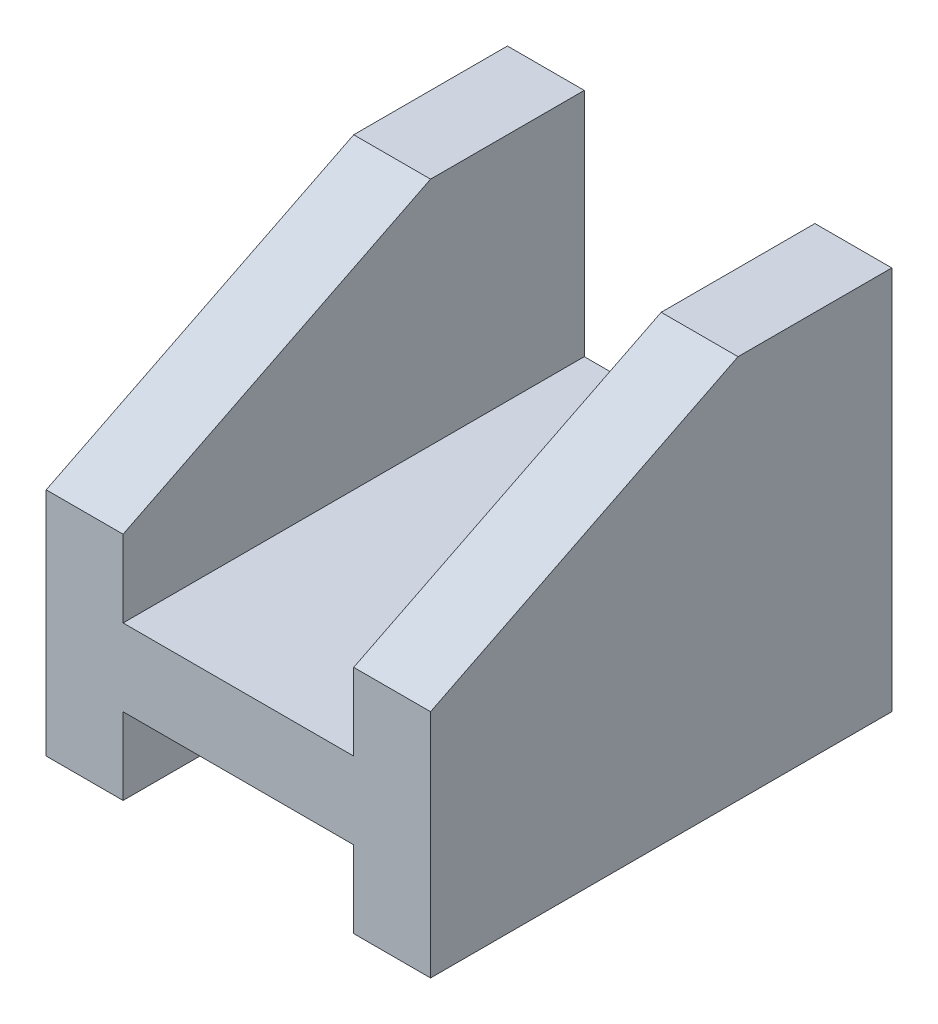
ISO-10303-21;
HEADER;
FILE_DESCRIPTION(('STEP AP214'),'2;1');
FILE_NAME('part.step','',(''),(''),'','','');
FILE_SCHEMA(('AUTOMOTIVE_DESIGN { 1 0 10303 214 1 1 1 1 }'));
ENDSEC;
DATA;
#1=APPLICATION_CONTEXT('core data for automotive mechanical design processes');
#2=APPLICATION_PROTOCOL_DEFINITION('international standard','automotive_design',2000,#1);
#3=PRODUCT_CONTEXT('',#1,'mechanical');
#4=PRODUCT('Part','Part','',(#3));
#5=PRODUCT_RELATED_PRODUCT_CATEGORY('part','',(#4));
#6=PRODUCT_DEFINITION_FORMATION('','',#4);
#7=PRODUCT_DEFINITION_CONTEXT('part definition',#1,'design');
#8=PRODUCT_DEFINITION('design','',#6,#7);
#9=PRODUCT_DEFINITION_SHAPE('','',#8);
#10=(LENGTH_UNIT() NAMED_UNIT(*) SI_UNIT(.MILLI.,.METRE.));
#11=(NAMED_UNIT(*) PLANE_ANGLE_UNIT() SI_UNIT($,.RADIAN.));
#12=(NAMED_UNIT(*) SI_UNIT($,.STERADIAN.) SOLID_ANGLE_UNIT());
#13=UNCERTAINTY_MEASURE_WITH_UNIT(LENGTH_MEASURE(1.E-05),#10,'distance_accuracy_value','');
#14=(GEOMETRIC_REPRESENTATION_CONTEXT(3) GLOBAL_UNCERTAINTY_ASSIGNED_CONTEXT((#13)) GLOBAL_UNIT_ASSIGNED_CONTEXT((#10,
#11,#12)) REPRESENTATION_CONTEXT('',''));
#15=CARTESIAN_POINT('',(0.,0.,0.));
#16=DIRECTION('',(0.,0.,1.));
#17=DIRECTION('',(1.,0.,0.));
#18=AXIS2_PLACEMENT_3D('',#15,#16,#17);
#19=CARTESIAN_POINT('',(9.525,-3.55,38.1));
#20=DIRECTION('',(1.,0.,0.));
#21=DIRECTION('',(0.,1.,0.));
#22=AXIS2_PLACEMENT_3D('',#19,#20,#21);
#23=PLANE('',#22);
#24=DIRECTION('',(0.,-1.,0.));
#25=VECTOR('',#24,1.);
#26=CARTESIAN_POINT('',(9.525,-3.55,0.));
#27=LINE('',#26,#25);
#28=CARTESIAN_POINT('',(9.525,-3.55,0.));
#29=VERTEX_POINT('',#28);
#30=CARTESIAN_POINT('',(9.525,-9.9,0.));
#31=VERTEX_POINT('',#30);
#32=EDGE_CURVE('E187',#29,#31,#27,.T.);
#33=ORIENTED_EDGE('',*,*,#32,.T.);
#34=DIRECTION('',(0.,0.,-1.));
#35=VECTOR('',#34,1.);
#36=CARTESIAN_POINT('',(9.525,-9.9,38.1));
#37=LINE('',#36,#35);
#38=CARTESIAN_POINT('',(9.525,-9.9,38.1));
#39=VERTEX_POINT('',#38);
#40=EDGE_CURVE('E40',#39,#31,#37,.T.);
#41=ORIENTED_EDGE('',*,*,#40,.F.);
#42=DIRECTION('',(0.,-1.,0.));
#43=VECTOR('',#42,1.);
#44=CARTESIAN_POINT('',(9.525,-3.55,38.1));
#45=LINE('',#44,#43);
#46=CARTESIAN_POINT('',(9.525,-3.55,38.1));
#47=VERTEX_POINT('',#46);
#48=EDGE_CURVE('E221',#47,#39,#45,.T.);
#49=ORIENTED_EDGE('',*,*,#48,.F.);
#50=DIRECTION('',(0.,0.,-1.));
#51=VECTOR('',#50,1.);
#52=CARTESIAN_POINT('',(9.525,-3.55,38.1));
#53=LINE('',#52,#51);
#54=EDGE_CURVE('E189',#47,#29,#53,.T.);
#55=ORIENTED_EDGE('',*,*,#54,.T.);
#56=EDGE_LOOP('',(#33,#41,#49,#55));
#57=FACE_BOUND('',#56,.T.);
#58=ADVANCED_FACE('F33',(#57),#23,.F.);
#59=CARTESIAN_POINT('',(15.875,-9.9,38.1));
#60=DIRECTION('',(0.,1.,0.));
#61=DIRECTION('',(0.,0.,1.));
#62=AXIS2_PLACEMENT_3D('',#59,#60,#61);
#63=PLANE('',#62);
#64=DIRECTION('',(1.,0.,0.));
#65=VECTOR('',#64,1.);
#66=CARTESIAN_POINT('',(15.875,-9.9,0.));
#67=LINE('',#66,#65);
#68=CARTESIAN_POINT('',(15.875,-9.9,0.));
#69=VERTEX_POINT('',#68);
#70=EDGE_CURVE('E180',#31,#69,#67,.T.);
#71=ORIENTED_EDGE('',*,*,#70,.T.);
#72=DIRECTION('',(0.,0.,-1.));
#73=VECTOR('',#72,1.);
#74=CARTESIAN_POINT('',(15.875,-9.9,38.1));
#75=LINE('',#74,#73);
#76=CARTESIAN_POINT('',(15.875,-9.9,38.1));
#77=VERTEX_POINT('',#76);
#78=EDGE_CURVE('E172',#77,#69,#75,.T.);
#79=ORIENTED_EDGE('',*,*,#78,.F.);
#80=DIRECTION('',(1.,0.,0.));
#81=VECTOR('',#80,1.);
#82=CARTESIAN_POINT('',(15.875,-9.9,38.1));
#83=LINE('',#82,#81);
#84=EDGE_CURVE('E181',#39,#77,#83,.T.);
#85=ORIENTED_EDGE('',*,*,#84,.F.);
#86=ORIENTED_EDGE('',*,*,#40,.T.);
#87=EDGE_LOOP('',(#71,#79,#85,#86));
#88=FACE_BOUND('',#87,.T.);
#89=ADVANCED_FACE('F178',(#88),#63,.F.);
#90=CARTESIAN_POINT('',(15.875,21.85,38.1));
#91=DIRECTION('',(-1.,0.,0.));
#92=DIRECTION('',(0.,-1.,0.));
#93=AXIS2_PLACEMENT_3D('',#90,#91,#92);
#94=PLANE('',#93);
#95=DIRECTION('',(0.,0.,-1.));
#96=VECTOR('',#95,1.);
#97=CARTESIAN_POINT('',(15.875,21.85,38.1));
#98=LINE('',#97,#96);
#99=CARTESIAN_POINT('',(15.875,21.85,12.7));
#100=VERTEX_POINT('',#99);
#101=CARTESIAN_POINT('',(15.875,21.85,0.));
#102=VERTEX_POINT('',#101);
#103=EDGE_CURVE('E170',#100,#102,#98,.T.);
#104=ORIENTED_EDGE('',*,*,#103,.F.);
#105=DIRECTION('',(0.,0.447213595499958,-0.894427190999916));
#106=VECTOR('',#105,1.);
#107=CARTESIAN_POINT('',(15.875,9.15,38.1));
#108=LINE('',#107,#106);
#109=CARTESIAN_POINT('',(15.875,9.15,38.1));
#110=VERTEX_POINT('',#109);
#111=EDGE_CURVE('E147',#110,#100,#108,.T.);
#112=ORIENTED_EDGE('',*,*,#111,.F.);
#113=DIRECTION('',(0.,1.,0.));
#114=VECTOR('',#113,1.);
#115=CARTESIAN_POINT('',(15.875,21.85,38.1));
#116=LINE('',#115,#114);
#117=EDGE_CURVE('E252',#77,#110,#116,.T.);
#118=ORIENTED_EDGE('',*,*,#117,.F.);
#119=ORIENTED_EDGE('',*,*,#78,.T.);
#120=DIRECTION('',(0.,1.,0.));
#121=VECTOR('',#120,1.);
#122=CARTESIAN_POINT('',(15.875,21.85,0.));
#123=LINE('',#122,#121);
#124=EDGE_CURVE('E193',#69,#102,#123,.T.);
#125=ORIENTED_EDGE('',*,*,#124,.T.);
#126=EDGE_LOOP('',(#104,#112,#118,#119,#125));
#127=FACE_BOUND('',#126,.T.);
#128=ADVANCED_FACE('F268',(#127),#94,.F.);
#129=CARTESIAN_POINT('',(9.525,21.85,38.1));
#130=DIRECTION('',(0.,-1.,0.));
#131=DIRECTION('',(0.,0.,-1.));
#132=AXIS2_PLACEMENT_3D('',#129,#130,#131);
#133=PLANE('',#132);
#134=DIRECTION('',(0.,0.,-1.));
#135=VECTOR('',#134,1.);
#136=CARTESIAN_POINT('',(9.525,21.85,38.1));
#137=LINE('',#136,#135);
#138=CARTESIAN_POINT('',(9.525,21.85,12.7));
#139=VERTEX_POINT('',#138);
#140=CARTESIAN_POINT('',(9.525,21.85,0.));
#141=VERTEX_POINT('',#140);
#142=EDGE_CURVE('E168',#139,#141,#137,.T.);
#143=ORIENTED_EDGE('',*,*,#142,.F.);
#144=DIRECTION('',(1.,0.,0.));
#145=VECTOR('',#144,1.);
#146=CARTESIAN_POINT('',(-15.875,21.85,12.7));
#147=LINE('',#146,#145);
#148=EDGE_CURVE('E137',#139,#100,#147,.T.);
#149=ORIENTED_EDGE('',*,*,#148,.T.);
#150=ORIENTED_EDGE('',*,*,#103,.T.);
#151=DIRECTION('',(-1.,0.,0.));
#152=VECTOR('',#151,1.);
#153=CARTESIAN_POINT('',(9.525,21.85,0.));
#154=LINE('',#153,#152);
#155=EDGE_CURVE('E202',#102,#141,#154,.T.);
#156=ORIENTED_EDGE('',*,*,#155,.T.);
#157=EDGE_LOOP('',(#143,#149,#150,#156));
#158=FACE_BOUND('',#157,.T.);
#159=ADVANCED_FACE('F267',(#158),#133,.F.);
#160=CARTESIAN_POINT('',(9.525,2.79999999999999,38.1));
#161=DIRECTION('',(1.,0.,0.));
#162=DIRECTION('',(0.,0.,-1.));
#163=AXIS2_PLACEMENT_3D('',#160,#161,#162);
#164=PLANE('',#163);
#165=DIRECTION('',(0.,-1.,0.));
#166=VECTOR('',#165,1.);
#167=CARTESIAN_POINT('',(9.525,2.79999999999999,38.1));
#168=LINE('',#167,#166);
#169=CARTESIAN_POINT('',(9.525,9.15,38.1));
#170=VERTEX_POINT('',#169);
#171=CARTESIAN_POINT('',(9.525,2.79999999999999,38.1));
#172=VERTEX_POINT('',#171);
#173=EDGE_CURVE('E250',#170,#172,#168,.T.);
#174=ORIENTED_EDGE('',*,*,#173,.F.);
#175=DIRECTION('',(0.,0.447213595499958,-0.894427190999916));
#176=VECTOR('',#175,1.);
#177=CARTESIAN_POINT('',(9.525,7.88,40.64));
#178=LINE('',#177,#176);
#179=EDGE_CURVE('E55',#170,#139,#178,.T.);
#180=ORIENTED_EDGE('',*,*,#179,.T.);
#181=ORIENTED_EDGE('',*,*,#142,.T.);
#182=DIRECTION('',(0.,-1.,0.));
#183=VECTOR('',#182,1.);
#184=CARTESIAN_POINT('',(9.525,2.79999999999999,0.));
#185=LINE('',#184,#183);
#186=CARTESIAN_POINT('',(9.525,2.79999999999999,0.));
#187=VERTEX_POINT('',#186);
#188=EDGE_CURVE('E205',#141,#187,#185,.T.);
#189=ORIENTED_EDGE('',*,*,#188,.T.);
#190=DIRECTION('',(0.,0.,-1.));
#191=VECTOR('',#190,1.);
#192=CARTESIAN_POINT('',(9.525,2.79999999999999,38.1));
#193=LINE('',#192,#191);
#194=EDGE_CURVE('E165',#172,#187,#193,.T.);
#195=ORIENTED_EDGE('',*,*,#194,.F.);
#196=EDGE_LOOP('',(#174,#180,#181,#189,#195));
#197=FACE_BOUND('',#196,.T.);
#198=ADVANCED_FACE('F277',(#197),#164,.F.);
#199=CARTESIAN_POINT('',(9.525,2.79999999999999,38.1));
#200=DIRECTION('',(0.,-1.,0.));
#201=DIRECTION('',(1.,0.,0.));
#202=AXIS2_PLACEMENT_3D('',#199,#200,#201);
#203=PLANE('',#202);
#204=DIRECTION('',(-1.,0.,0.));
#205=VECTOR('',#204,1.);
#206=CARTESIAN_POINT('',(9.525,2.79999999999999,0.));
#207=LINE('',#206,#205);
#208=CARTESIAN_POINT('',(-9.525,2.8,0.));
#209=VERTEX_POINT('',#208);
#210=EDGE_CURVE('E207',#187,#209,#207,.T.);
#211=ORIENTED_EDGE('',*,*,#210,.T.);
#212=DIRECTION('',(0.,0.,-1.));
#213=VECTOR('',#212,1.);
#214=CARTESIAN_POINT('',(-9.525,2.8,38.1));
#215=LINE('',#214,#213);
#216=CARTESIAN_POINT('',(-9.525,2.8,38.1));
#217=VERTEX_POINT('',#216);
#218=EDGE_CURVE('E156',#217,#209,#215,.T.);
#219=ORIENTED_EDGE('',*,*,#218,.F.);
#220=DIRECTION('',(-1.,0.,0.));
#221=VECTOR('',#220,1.);
#222=CARTESIAN_POINT('',(9.525,2.79999999999999,38.1));
#223=LINE('',#222,#221);
#224=EDGE_CURVE('E248',#172,#217,#223,.T.);
#225=ORIENTED_EDGE('',*,*,#224,.F.);
#226=ORIENTED_EDGE('',*,*,#194,.T.);
#227=EDGE_LOOP('',(#211,#219,#225,#226));
#228=FACE_BOUND('',#227,.T.);
#229=ADVANCED_FACE('F280',(#228),#203,.F.);
#230=CARTESIAN_POINT('',(-9.525,2.8,38.1));
#231=DIRECTION('',(-1.,0.,0.));
#232=DIRECTION('',(0.,0.,1.));
#233=AXIS2_PLACEMENT_3D('',#230,#231,#232);
#234=PLANE('',#233);
#235=DIRECTION('',(0.,0.,-1.));
#236=VECTOR('',#235,1.);
#237=CARTESIAN_POINT('',(-9.525,21.85,38.1));
#238=LINE('',#237,#236);
#239=CARTESIAN_POINT('',(-9.525,21.85,12.7));
#240=VERTEX_POINT('',#239);
#241=CARTESIAN_POINT('',(-9.525,21.85,0.));
#242=VERTEX_POINT('',#241);
#243=EDGE_CURVE('E153',#240,#242,#238,.T.);
#244=ORIENTED_EDGE('',*,*,#243,.F.);
#245=DIRECTION('',(0.,-0.447213595499958,0.894427190999916));
#246=VECTOR('',#245,1.);
#247=CARTESIAN_POINT('',(-9.525,7.88,40.64));
#248=LINE('',#247,#246);
#249=CARTESIAN_POINT('',(-9.525,9.15,38.1));
#250=VERTEX_POINT('',#249);
#251=EDGE_CURVE('E133',#240,#250,#248,.T.);
#252=ORIENTED_EDGE('',*,*,#251,.T.);
#253=DIRECTION('',(0.,1.,0.));
#254=VECTOR('',#253,1.);
#255=CARTESIAN_POINT('',(-9.525,2.8,38.1));
#256=LINE('',#255,#254);
#257=EDGE_CURVE('E245',#217,#250,#256,.T.);
#258=ORIENTED_EDGE('',*,*,#257,.F.);
#259=ORIENTED_EDGE('',*,*,#218,.T.);
#260=DIRECTION('',(0.,1.,0.));
#261=VECTOR('',#260,1.);
#262=CARTESIAN_POINT('',(-9.525,2.8,0.));
#263=LINE('',#262,#261);
#264=EDGE_CURVE('E209',#209,#242,#263,.T.);
#265=ORIENTED_EDGE('',*,*,#264,.T.);
#266=EDGE_LOOP('',(#244,#252,#258,#259,#265));
#267=FACE_BOUND('',#266,.T.);
#268=ADVANCED_FACE('F285',(#267),#234,.F.);
#269=CARTESIAN_POINT('',(-9.525,21.85,38.1));
#270=DIRECTION('',(0.,-1.,0.));
#271=DIRECTION('',(0.,0.,-1.));
#272=AXIS2_PLACEMENT_3D('',#269,#270,#271);
#273=PLANE('',#272);
#274=DIRECTION('',(0.,0.,-1.));
#275=VECTOR('',#274,1.);
#276=CARTESIAN_POINT('',(-15.875,21.85,38.1));
#277=LINE('',#276,#275);
#278=CARTESIAN_POINT('',(-15.875,21.85,12.7));
#279=VERTEX_POINT('',#278);
#280=CARTESIAN_POINT('',(-15.875,21.85,0.));
#281=VERTEX_POINT('',#280);
#282=EDGE_CURVE('E142',#279,#281,#277,.T.);
#283=ORIENTED_EDGE('',*,*,#282,.F.);
#284=EDGE_CURVE('E130',#279,#240,#147,.T.);
#285=ORIENTED_EDGE('',*,*,#284,.T.);
#286=ORIENTED_EDGE('',*,*,#243,.T.);
#287=DIRECTION('',(-1.,0.,0.));
#288=VECTOR('',#287,1.);
#289=CARTESIAN_POINT('',(-9.525,21.85,0.));
#290=LINE('',#289,#288);
#291=EDGE_CURVE('E151',#242,#281,#290,.T.);
#292=ORIENTED_EDGE('',*,*,#291,.T.);
#293=EDGE_LOOP('',(#283,#285,#286,#292));
#294=FACE_BOUND('',#293,.T.);
#295=ADVANCED_FACE('F149',(#294),#273,.F.);
#296=CARTESIAN_POINT('',(-15.875,21.85,38.1));
#297=DIRECTION('',(1.,0.,0.));
#298=DIRECTION('',(0.,1.,0.));
#299=AXIS2_PLACEMENT_3D('',#296,#297,#298);
#300=PLANE('',#299);
#301=DIRECTION('',(0.,-1.,0.));
#302=VECTOR('',#301,1.);
#303=CARTESIAN_POINT('',(-15.875,21.85,38.1));
#304=LINE('',#303,#302);
#305=CARTESIAN_POINT('',(-15.875,9.15,38.1));
#306=VERTEX_POINT('',#305);
#307=CARTESIAN_POINT('',(-15.875,-9.9,38.1));
#308=VERTEX_POINT('',#307);
#309=EDGE_CURVE('E145',#306,#308,#304,.T.);
#310=ORIENTED_EDGE('',*,*,#309,.F.);
#311=DIRECTION('',(0.,0.447213595499958,-0.894427190999916));
#312=VECTOR('',#311,1.);
#313=CARTESIAN_POINT('',(-15.875,9.15,38.1));
#314=LINE('',#313,#312);
#315=EDGE_CURVE('E47',#306,#279,#314,.T.);
#316=ORIENTED_EDGE('',*,*,#315,.T.);
#317=ORIENTED_EDGE('',*,*,#282,.T.);
#318=DIRECTION('',(0.,-1.,0.));
#319=VECTOR('',#318,1.);
#320=CARTESIAN_POINT('',(-15.875,21.85,0.));
#321=LINE('',#320,#319);
#322=CARTESIAN_POINT('',(-15.875,-9.9,0.));
#323=VERTEX_POINT('',#322);
#324=EDGE_CURVE('E213',#281,#323,#321,.T.);
#325=ORIENTED_EDGE('',*,*,#324,.T.);
#326=DIRECTION('',(0.,0.,-1.));
#327=VECTOR('',#326,1.);
#328=CARTESIAN_POINT('',(-15.875,-9.9,38.1));
#329=LINE('',#328,#327);
#330=EDGE_CURVE('E154',#308,#323,#329,.T.);
#331=ORIENTED_EDGE('',*,*,#330,.F.);
#332=EDGE_LOOP('',(#310,#316,#317,#325,#331));
#333=FACE_BOUND('',#332,.T.);
#334=ADVANCED_FACE('F141',(#333),#300,.F.);
#335=CARTESIAN_POINT('',(-15.875,-9.9,38.1));
#336=DIRECTION('',(0.,1.,0.));
#337=DIRECTION('',(0.,0.,1.));
#338=AXIS2_PLACEMENT_3D('',#335,#336,#337);
#339=PLANE('',#338);
#340=DIRECTION('',(1.,0.,0.));
#341=VECTOR('',#340,1.);
#342=CARTESIAN_POINT('',(-15.875,-9.9,0.));
#343=LINE('',#342,#341);
#344=CARTESIAN_POINT('',(-9.525,-9.9,0.));
#345=VERTEX_POINT('',#344);
#346=EDGE_CURVE('E215',#323,#345,#343,.T.);
#347=ORIENTED_EDGE('',*,*,#346,.T.);
#348=DIRECTION('',(0.,0.,-1.));
#349=VECTOR('',#348,1.);
#350=CARTESIAN_POINT('',(-9.525,-9.9,38.1));
#351=LINE('',#350,#349);
#352=CARTESIAN_POINT('',(-9.525,-9.9,38.1));
#353=VERTEX_POINT('',#352);
#354=EDGE_CURVE('E159',#353,#345,#351,.T.);
#355=ORIENTED_EDGE('',*,*,#354,.F.);
#356=DIRECTION('',(1.,0.,0.));
#357=VECTOR('',#356,1.);
#358=CARTESIAN_POINT('',(-15.875,-9.9,38.1));
#359=LINE('',#358,#357);
#360=EDGE_CURVE('E241',#308,#353,#359,.T.);
#361=ORIENTED_EDGE('',*,*,#360,.F.);
#362=ORIENTED_EDGE('',*,*,#330,.T.);
#363=EDGE_LOOP('',(#347,#355,#361,#362));
#364=FACE_BOUND('',#363,.T.);
#365=ADVANCED_FACE('F286',(#364),#339,.F.);
#366=CARTESIAN_POINT('',(-9.525,-3.55,38.1));
#367=DIRECTION('',(-1.,0.,0.));
#368=DIRECTION('',(0.,-1.,0.));
#369=AXIS2_PLACEMENT_3D('',#366,#367,#368);
#370=PLANE('',#369);
#371=DIRECTION('',(0.,1.,0.));
#372=VECTOR('',#371,1.);
#373=CARTESIAN_POINT('',(-9.525,-3.55,0.));
#374=LINE('',#373,#372);
#375=CARTESIAN_POINT('',(-9.525,-3.55,0.));
#376=VERTEX_POINT('',#375);
#377=EDGE_CURVE('E217',#345,#376,#374,.T.);
#378=ORIENTED_EDGE('',*,*,#377,.T.);
#379=DIRECTION('',(0.,0.,-1.));
#380=VECTOR('',#379,1.);
#381=CARTESIAN_POINT('',(-9.525,-3.55,38.1));
#382=LINE('',#381,#380);
#383=CARTESIAN_POINT('',(-9.525,-3.55,38.1));
#384=VERTEX_POINT('',#383);
#385=EDGE_CURVE('E223',#384,#376,#382,.T.);
#386=ORIENTED_EDGE('',*,*,#385,.F.);
#387=DIRECTION('',(0.,1.,0.));
#388=VECTOR('',#387,1.);
#389=CARTESIAN_POINT('',(-9.525,-3.55,38.1));
#390=LINE('',#389,#388);
#391=EDGE_CURVE('E232',#353,#384,#390,.T.);
#392=ORIENTED_EDGE('',*,*,#391,.F.);
#393=ORIENTED_EDGE('',*,*,#354,.T.);
#394=EDGE_LOOP('',(#378,#386,#392,#393));
#395=FACE_BOUND('',#394,.T.);
#396=ADVANCED_FACE('F230',(#395),#370,.F.);
#397=CARTESIAN_POINT('',(9.525,-3.55,38.1));
#398=DIRECTION('',(0.,1.,0.));
#399=DIRECTION('',(-1.,0.,0.));
#400=AXIS2_PLACEMENT_3D('',#397,#398,#399);
#401=PLANE('',#400);
#402=DIRECTION('',(1.,0.,0.));
#403=VECTOR('',#402,1.);
#404=CARTESIAN_POINT('',(9.525,-3.55,0.));
#405=LINE('',#404,#403);
#406=EDGE_CURVE('E219',#376,#29,#405,.T.);
#407=ORIENTED_EDGE('',*,*,#406,.T.);
#408=ORIENTED_EDGE('',*,*,#54,.F.);
#409=DIRECTION('',(1.,0.,0.));
#410=VECTOR('',#409,1.);
#411=CARTESIAN_POINT('',(9.525,-3.55,38.1));
#412=LINE('',#411,#410);
#413=EDGE_CURVE('E197',#384,#47,#412,.T.);
#414=ORIENTED_EDGE('',*,*,#413,.F.);
#415=ORIENTED_EDGE('',*,*,#385,.T.);
#416=EDGE_LOOP('',(#407,#408,#414,#415));
#417=FACE_BOUND('',#416,.T.);
#418=ADVANCED_FACE('F238',(#417),#401,.F.);
#419=CARTESIAN_POINT('',(0.,0.,38.1));
#420=DIRECTION('',(0.,0.,-1.));
#421=DIRECTION('',(-1.,0.,0.));
#422=AXIS2_PLACEMENT_3D('',#419,#420,#421);
#423=PLANE('',#422);
#424=ORIENTED_EDGE('',*,*,#117,.T.);
#425=DIRECTION('',(-1.,0.,0.));
#426=VECTOR('',#425,1.);
#427=CARTESIAN_POINT('',(0.,9.15,38.1));
#428=LINE('',#427,#426);
#429=EDGE_CURVE('E11',#110,#170,#428,.T.);
#430=ORIENTED_EDGE('',*,*,#429,.T.);
#431=ORIENTED_EDGE('',*,*,#173,.T.);
#432=ORIENTED_EDGE('',*,*,#224,.T.);
#433=ORIENTED_EDGE('',*,*,#257,.T.);
#434=DIRECTION('',(1.,0.,0.));
#435=VECTOR('',#434,1.);
#436=CARTESIAN_POINT('',(-15.875,9.15,38.1));
#437=LINE('',#436,#435);
#438=EDGE_CURVE('E146',#306,#250,#437,.T.);
#439=ORIENTED_EDGE('',*,*,#438,.F.);
#440=ORIENTED_EDGE('',*,*,#309,.T.);
#441=ORIENTED_EDGE('',*,*,#360,.T.);
#442=ORIENTED_EDGE('',*,*,#391,.T.);
#443=ORIENTED_EDGE('',*,*,#413,.T.);
#444=ORIENTED_EDGE('',*,*,#48,.T.);
#445=ORIENTED_EDGE('',*,*,#84,.T.);
#446=EDGE_LOOP('',(#424,#430,#431,#432,#433,#439,#440,#441,#442,#443,#444,#445));
#447=FACE_BOUND('',#446,.T.);
#448=ADVANCED_FACE('F283',(#447),#423,.F.);
#449=CARTESIAN_POINT('',(0.,0.,0.));
#450=DIRECTION('',(0.,0.,-1.));
#451=DIRECTION('',(-1.,0.,0.));
#452=AXIS2_PLACEMENT_3D('',#449,#450,#451);
#453=PLANE('',#452);
#454=ORIENTED_EDGE('',*,*,#32,.F.);
#455=ORIENTED_EDGE('',*,*,#406,.F.);
#456=ORIENTED_EDGE('',*,*,#377,.F.);
#457=ORIENTED_EDGE('',*,*,#346,.F.);
#458=ORIENTED_EDGE('',*,*,#324,.F.);
#459=ORIENTED_EDGE('',*,*,#291,.F.);
#460=ORIENTED_EDGE('',*,*,#264,.F.);
#461=ORIENTED_EDGE('',*,*,#210,.F.);
#462=ORIENTED_EDGE('',*,*,#188,.F.);
#463=ORIENTED_EDGE('',*,*,#155,.F.);
#464=ORIENTED_EDGE('',*,*,#124,.F.);
#465=ORIENTED_EDGE('',*,*,#70,.F.);
#466=EDGE_LOOP('',(#454,#455,#456,#457,#458,#459,#460,#461,#462,#463,#464,#465));
#467=FACE_BOUND('',#466,.T.);
#468=ADVANCED_FACE('F236',(#467),#453,.T.);
#469=CARTESIAN_POINT('',(-15.875,9.15,38.1));
#470=DIRECTION('',(0.,-0.894427190999916,-0.447213595499958));
#471=DIRECTION('',(0.,0.447213595499958,-0.894427190999916));
#472=AXIS2_PLACEMENT_3D('',#469,#470,#471);
#473=PLANE('',#472);
#474=ORIENTED_EDGE('',*,*,#284,.F.);
#475=ORIENTED_EDGE('',*,*,#315,.F.);
#476=ORIENTED_EDGE('',*,*,#438,.T.);
#477=ORIENTED_EDGE('',*,*,#251,.F.);
#478=EDGE_LOOP('',(#474,#475,#476,#477));
#479=FACE_BOUND('',#478,.T.);
#480=ADVANCED_FACE('F131',(#479),#473,.F.);
#481=ORIENTED_EDGE('',*,*,#429,.F.);
#482=ORIENTED_EDGE('',*,*,#111,.T.);
#483=ORIENTED_EDGE('',*,*,#148,.F.);
#484=ORIENTED_EDGE('',*,*,#179,.F.);
#485=EDGE_LOOP('',(#481,#482,#483,#484));
#486=FACE_BOUND('',#485,.T.);
#487=ADVANCED_FACE('F261',(#486),#473,.F.);
#488=CLOSED_SHELL('',(#58,#89,#128,#159,#198,#229,#268,#295,#334,#365,#396,#418,#448,#468,#480,#487));
#489=MANIFOLD_SOLID_BREP('B2',#488);
#490=ADVANCED_BREP_SHAPE_REPRESENTATION('',(#18,#489),#14);
#491=SHAPE_DEFINITION_REPRESENTATION(#9,#490);
ENDSEC;
END-ISO-10303-21;
